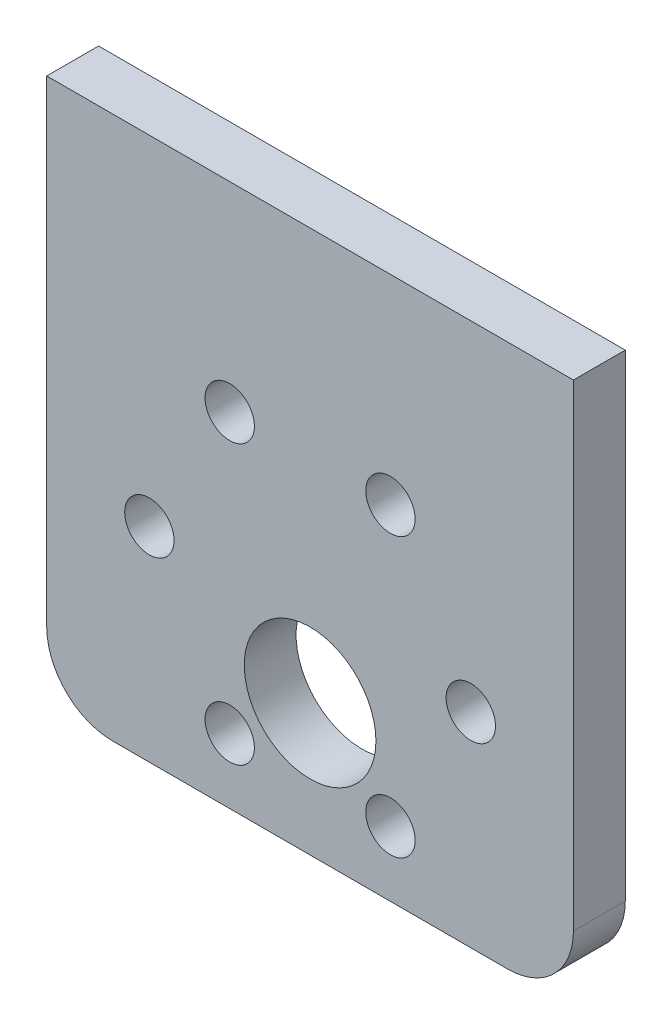
ISO-10303-21;
HEADER;
FILE_DESCRIPTION(('STEP AP214'),'2;1');
FILE_NAME('part.step','',(''),(''),'','','');
FILE_SCHEMA(('AUTOMOTIVE_DESIGN { 1 0 10303 214 1 1 1 1 }'));
ENDSEC;
DATA;
#1=APPLICATION_CONTEXT('core data for automotive mechanical design processes');
#2=APPLICATION_PROTOCOL_DEFINITION('international standard','automotive_design',2000,#1);
#3=PRODUCT_CONTEXT('',#1,'mechanical');
#4=PRODUCT('Part','Part','',(#3));
#5=PRODUCT_RELATED_PRODUCT_CATEGORY('part','',(#4));
#6=PRODUCT_DEFINITION_FORMATION('','',#4);
#7=PRODUCT_DEFINITION_CONTEXT('part definition',#1,'design');
#8=PRODUCT_DEFINITION('design','',#6,#7);
#9=PRODUCT_DEFINITION_SHAPE('','',#8);
#10=(LENGTH_UNIT() NAMED_UNIT(*) SI_UNIT(.MILLI.,.METRE.));
#11=(NAMED_UNIT(*) PLANE_ANGLE_UNIT() SI_UNIT($,.RADIAN.));
#12=(NAMED_UNIT(*) SI_UNIT($,.STERADIAN.) SOLID_ANGLE_UNIT());
#13=UNCERTAINTY_MEASURE_WITH_UNIT(LENGTH_MEASURE(1.E-05),#10,'distance_accuracy_value','');
#14=(GEOMETRIC_REPRESENTATION_CONTEXT(3) GLOBAL_UNCERTAINTY_ASSIGNED_CONTEXT((#13)) GLOBAL_UNIT_ASSIGNED_CONTEXT((#10,
#11,#12)) REPRESENTATION_CONTEXT('',''));
#15=CARTESIAN_POINT('',(0.,0.,0.));
#16=DIRECTION('',(0.,0.,1.));
#17=DIRECTION('',(1.,0.,0.));
#18=AXIS2_PLACEMENT_3D('',#15,#16,#17);
#19=CARTESIAN_POINT('',(25.4,-26.1874,2.5));
#20=DIRECTION('',(-1.,0.,0.));
#21=DIRECTION('',(0.,0.,1.));
#22=AXIS2_PLACEMENT_3D('',#19,#20,#21);
#23=PLANE('',#22);
#24=DIRECTION('',(0.,1.,0.));
#25=VECTOR('',#24,1.);
#26=CARTESIAN_POINT('',(25.4,-26.1874,2.5));
#27=LINE('',#26,#25);
#28=CARTESIAN_POINT('',(25.4,-19.8374,2.5));
#29=VERTEX_POINT('',#28);
#30=CARTESIAN_POINT('',(25.4,26.1874,2.5));
#31=VERTEX_POINT('',#30);
#32=EDGE_CURVE('E88',#29,#31,#27,.T.);
#33=ORIENTED_EDGE('',*,*,#32,.F.);
#34=DIRECTION('',(0.,0.,-1.));
#35=VECTOR('',#34,1.);
#36=CARTESIAN_POINT('',(25.4,-19.8374,2.5));
#37=LINE('',#36,#35);
#38=CARTESIAN_POINT('',(25.4,-19.8374,-2.5));
#39=VERTEX_POINT('',#38);
#40=EDGE_CURVE('E111',#29,#39,#37,.T.);
#41=ORIENTED_EDGE('',*,*,#40,.T.);
#42=DIRECTION('',(0.,1.,0.));
#43=VECTOR('',#42,1.);
#44=CARTESIAN_POINT('',(25.4,-26.1874,-2.5));
#45=LINE('',#44,#43);
#46=CARTESIAN_POINT('',(25.4,26.1874,-2.5));
#47=VERTEX_POINT('',#46);
#48=EDGE_CURVE('E109',#39,#47,#45,.T.);
#49=ORIENTED_EDGE('',*,*,#48,.T.);
#50=DIRECTION('',(0.,0.,-1.));
#51=VECTOR('',#50,1.);
#52=CARTESIAN_POINT('',(25.4,26.1874,2.5));
#53=LINE('',#52,#51);
#54=EDGE_CURVE('E103',#31,#47,#53,.T.);
#55=ORIENTED_EDGE('',*,*,#54,.F.);
#56=EDGE_LOOP('',(#33,#41,#49,#55));
#57=FACE_BOUND('',#56,.T.);
#58=ADVANCED_FACE('F34',(#57),#23,.F.);
#59=CARTESIAN_POINT('',(-25.4,26.1874,2.5));
#60=DIRECTION('',(0.,-1.,0.));
#61=DIRECTION('',(0.,0.,-1.));
#62=AXIS2_PLACEMENT_3D('',#59,#60,#61);
#63=PLANE('',#62);
#64=DIRECTION('',(-1.,0.,0.));
#65=VECTOR('',#64,1.);
#66=CARTESIAN_POINT('',(-25.4,26.1874,-2.5));
#67=LINE('',#66,#65);
#68=CARTESIAN_POINT('',(-25.4,26.1874,-2.5));
#69=VERTEX_POINT('',#68);
#70=EDGE_CURVE('E138',#47,#69,#67,.T.);
#71=ORIENTED_EDGE('',*,*,#70,.T.);
#72=DIRECTION('',(0.,0.,-1.));
#73=VECTOR('',#72,1.);
#74=CARTESIAN_POINT('',(-25.4,26.1874,2.5));
#75=LINE('',#74,#73);
#76=CARTESIAN_POINT('',(-25.4,26.1874,2.5));
#77=VERTEX_POINT('',#76);
#78=EDGE_CURVE('E105',#77,#69,#75,.T.);
#79=ORIENTED_EDGE('',*,*,#78,.F.);
#80=DIRECTION('',(-1.,0.,0.));
#81=VECTOR('',#80,1.);
#82=CARTESIAN_POINT('',(-25.4,26.1874,2.5));
#83=LINE('',#82,#81);
#84=EDGE_CURVE('E91',#31,#77,#83,.T.);
#85=ORIENTED_EDGE('',*,*,#84,.F.);
#86=ORIENTED_EDGE('',*,*,#54,.T.);
#87=EDGE_LOOP('',(#71,#79,#85,#86));
#88=FACE_BOUND('',#87,.T.);
#89=ADVANCED_FACE('F102',(#88),#63,.F.);
#90=CARTESIAN_POINT('',(-25.4,-26.1874,2.5));
#91=DIRECTION('',(1.,0.,0.));
#92=DIRECTION('',(0.,0.,-1.));
#93=AXIS2_PLACEMENT_3D('',#90,#91,#92);
#94=PLANE('',#93);
#95=DIRECTION('',(0.,-1.,0.));
#96=VECTOR('',#95,1.);
#97=CARTESIAN_POINT('',(-25.4,-26.1874,-2.5));
#98=LINE('',#97,#96);
#99=CARTESIAN_POINT('',(-25.4,-19.8374,-2.5));
#100=VERTEX_POINT('',#99);
#101=EDGE_CURVE('E136',#69,#100,#98,.T.);
#102=ORIENTED_EDGE('',*,*,#101,.T.);
#103=DIRECTION('',(0.,0.,-1.));
#104=VECTOR('',#103,1.);
#105=CARTESIAN_POINT('',(-25.4,-19.8374,2.5));
#106=LINE('',#105,#104);
#107=CARTESIAN_POINT('',(-25.4,-19.8374,2.5));
#108=VERTEX_POINT('',#107);
#109=EDGE_CURVE('E11',#100,#108,#106,.F.);
#110=ORIENTED_EDGE('',*,*,#109,.T.);
#111=DIRECTION('',(0.,-1.,0.));
#112=VECTOR('',#111,1.);
#113=CARTESIAN_POINT('',(-25.4,-26.1874,2.5));
#114=LINE('',#113,#112);
#115=EDGE_CURVE('E106',#77,#108,#114,.T.);
#116=ORIENTED_EDGE('',*,*,#115,.F.);
#117=ORIENTED_EDGE('',*,*,#78,.T.);
#118=EDGE_LOOP('',(#102,#110,#116,#117));
#119=FACE_BOUND('',#118,.T.);
#120=ADVANCED_FACE('F137',(#119),#94,.F.);
#121=CARTESIAN_POINT('',(-25.4,-26.1874,2.5));
#122=DIRECTION('',(0.,1.,0.));
#123=DIRECTION('',(0.,0.,1.));
#124=AXIS2_PLACEMENT_3D('',#121,#122,#123);
#125=PLANE('',#124);
#126=DIRECTION('',(1.,0.,0.));
#127=VECTOR('',#126,1.);
#128=CARTESIAN_POINT('',(-25.4,-26.1874,-2.5));
#129=LINE('',#128,#127);
#130=CARTESIAN_POINT('',(-19.05,-26.1874,-2.5));
#131=VERTEX_POINT('',#130);
#132=CARTESIAN_POINT('',(19.05,-26.1874,-2.5));
#133=VERTEX_POINT('',#132);
#134=EDGE_CURVE('E98',#131,#133,#129,.T.);
#135=ORIENTED_EDGE('',*,*,#134,.T.);
#136=DIRECTION('',(0.,0.,-1.));
#137=VECTOR('',#136,1.);
#138=CARTESIAN_POINT('',(19.05,-26.1874,2.5));
#139=LINE('',#138,#137);
#140=CARTESIAN_POINT('',(19.05,-26.1874,2.5));
#141=VERTEX_POINT('',#140);
#142=EDGE_CURVE('E55',#133,#141,#139,.F.);
#143=ORIENTED_EDGE('',*,*,#142,.T.);
#144=DIRECTION('',(1.,0.,0.));
#145=VECTOR('',#144,1.);
#146=CARTESIAN_POINT('',(-25.4,-26.1874,2.5));
#147=LINE('',#146,#145);
#148=CARTESIAN_POINT('',(-19.05,-26.1874,2.5));
#149=VERTEX_POINT('',#148);
#150=EDGE_CURVE('E115',#149,#141,#147,.T.);
#151=ORIENTED_EDGE('',*,*,#150,.F.);
#152=DIRECTION('',(0.,0.,-1.));
#153=VECTOR('',#152,1.);
#154=CARTESIAN_POINT('',(-19.05,-26.1874,2.5));
#155=LINE('',#154,#153);
#156=EDGE_CURVE('E122',#149,#131,#155,.T.);
#157=ORIENTED_EDGE('',*,*,#156,.T.);
#158=EDGE_LOOP('',(#135,#143,#151,#157));
#159=FACE_BOUND('',#158,.T.);
#160=ADVANCED_FACE('F130',(#159),#125,.F.);
#161=CARTESIAN_POINT('',(0.,0.,2.5));
#162=DIRECTION('',(0.,0.,-1.));
#163=DIRECTION('',(-1.,0.,0.));
#164=AXIS2_PLACEMENT_3D('',#161,#162,#163);
#165=PLANE('',#164);
#166=CARTESIAN_POINT('',(-15.5,-6.48740000000015,2.5));
#167=DIRECTION('',(0.,0.,-1.));
#168=DIRECTION('',(-1.,0.,0.));
#169=AXIS2_PLACEMENT_3D('',#166,#167,#168);
#170=CIRCLE('',#169,2.38125);
#171=CARTESIAN_POINT('',(-17.88125,-6.48740000000015,2.5));
#172=VERTEX_POINT('',#171);
#173=EDGE_CURVE('E180',#172,#172,#170,.T.);
#174=ORIENTED_EDGE('',*,*,#173,.T.);
#175=EDGE_LOOP('',(#174));
#176=FACE_BOUND('',#175,.T.);
#177=CARTESIAN_POINT('',(-7.75000000000013,6.93599375865875,2.5));
#178=DIRECTION('',(0.,0.,-1.));
#179=DIRECTION('',(-1.,0.,0.));
#180=AXIS2_PLACEMENT_3D('',#177,#178,#179);
#181=CIRCLE('',#180,2.38125);
#182=CARTESIAN_POINT('',(-10.1312500000001,6.93599375865875,2.5));
#183=VERTEX_POINT('',#182);
#184=EDGE_CURVE('E174',#183,#183,#181,.T.);
#185=ORIENTED_EDGE('',*,*,#184,.T.);
#186=EDGE_LOOP('',(#185));
#187=FACE_BOUND('',#186,.T.);
#188=CARTESIAN_POINT('',(7.75,6.93599375865881,2.5));
#189=DIRECTION('',(0.,0.,-1.));
#190=DIRECTION('',(-1.,0.,0.));
#191=AXIS2_PLACEMENT_3D('',#188,#189,#190);
#192=CIRCLE('',#191,2.38125);
#193=CARTESIAN_POINT('',(5.36875,6.93599375865881,2.5));
#194=VERTEX_POINT('',#193);
#195=EDGE_CURVE('E168',#194,#194,#192,.T.);
#196=ORIENTED_EDGE('',*,*,#195,.T.);
#197=EDGE_LOOP('',(#196));
#198=FACE_BOUND('',#197,.T.);
#199=CARTESIAN_POINT('',(15.5,-6.48739999999993,2.5));
#200=DIRECTION('',(0.,0.,-1.));
#201=DIRECTION('',(-1.,0.,0.));
#202=AXIS2_PLACEMENT_3D('',#199,#200,#201);
#203=CIRCLE('',#202,2.38125);
#204=CARTESIAN_POINT('',(13.11875,-6.48739999999993,2.5));
#205=VERTEX_POINT('',#204);
#206=EDGE_CURVE('E162',#205,#205,#203,.T.);
#207=ORIENTED_EDGE('',*,*,#206,.T.);
#208=EDGE_LOOP('',(#207));
#209=FACE_BOUND('',#208,.T.);
#210=CARTESIAN_POINT('',(-7.75000000000003,-19.9107937586588,2.5));
#211=DIRECTION('',(0.,0.,-1.));
#212=DIRECTION('',(-1.,0.,0.));
#213=AXIS2_PLACEMENT_3D('',#210,#211,#212);
#214=CIRCLE('',#213,2.38125);
#215=CARTESIAN_POINT('',(-10.13125,-19.9107937586588,2.5));
#216=VERTEX_POINT('',#215);
#217=EDGE_CURVE('E156',#216,#216,#214,.T.);
#218=ORIENTED_EDGE('',*,*,#217,.T.);
#219=EDGE_LOOP('',(#218));
#220=FACE_BOUND('',#219,.T.);
#221=CARTESIAN_POINT('',(7.75,-19.9107937586588,2.5));
#222=DIRECTION('',(0.,0.,-1.));
#223=DIRECTION('',(-1.,0.,0.));
#224=AXIS2_PLACEMENT_3D('',#221,#222,#223);
#225=CIRCLE('',#224,2.38125);
#226=CARTESIAN_POINT('',(5.36875,-19.9107937586588,2.5));
#227=VERTEX_POINT('',#226);
#228=EDGE_CURVE('E150',#227,#227,#225,.T.);
#229=ORIENTED_EDGE('',*,*,#228,.T.);
#230=EDGE_LOOP('',(#229));
#231=FACE_BOUND('',#230,.T.);
#232=CARTESIAN_POINT('',(0.,-13.4874,2.5));
#233=DIRECTION('',(0.,0.,1.));
#234=DIRECTION('',(1.,0.,0.));
#235=AXIS2_PLACEMENT_3D('',#232,#233,#234);
#236=CIRCLE('',#235,6.34999999999999);
#237=CARTESIAN_POINT('',(6.34999999999999,-13.4874,2.5));
#238=VERTEX_POINT('',#237);
#239=EDGE_CURVE('E147',#238,#238,#236,.T.);
#240=ORIENTED_EDGE('',*,*,#239,.F.);
#241=EDGE_LOOP('',(#240));
#242=FACE_BOUND('',#241,.T.);
#243=ORIENTED_EDGE('',*,*,#150,.T.);
#244=CARTESIAN_POINT('',(19.05,-19.8374,2.5));
#245=DIRECTION('',(0.,0.,-1.));
#246=DIRECTION('',(-1.,0.,0.));
#247=AXIS2_PLACEMENT_3D('',#244,#245,#246);
#248=CIRCLE('',#247,6.35);
#249=EDGE_CURVE('E42',#141,#29,#248,.F.);
#250=ORIENTED_EDGE('',*,*,#249,.T.);
#251=ORIENTED_EDGE('',*,*,#32,.T.);
#252=ORIENTED_EDGE('',*,*,#84,.T.);
#253=ORIENTED_EDGE('',*,*,#115,.T.);
#254=CARTESIAN_POINT('',(-19.05,-19.8374,2.5));
#255=DIRECTION('',(0.,0.,-1.));
#256=DIRECTION('',(-1.,0.,0.));
#257=AXIS2_PLACEMENT_3D('',#254,#255,#256);
#258=CIRCLE('',#257,6.35);
#259=EDGE_CURVE('E126',#108,#149,#258,.F.);
#260=ORIENTED_EDGE('',*,*,#259,.T.);
#261=EDGE_LOOP('',(#243,#250,#251,#252,#253,#260));
#262=FACE_BOUND('',#261,.T.);
#263=ADVANCED_FACE('F90',(#176,#187,#198,#209,#220,#231,#242,#262),#165,.F.);
#264=CARTESIAN_POINT('',(0.,0.,-2.5));
#265=DIRECTION('',(0.,0.,-1.));
#266=DIRECTION('',(-1.,0.,0.));
#267=AXIS2_PLACEMENT_3D('',#264,#265,#266);
#268=PLANE('',#267);
#269=CARTESIAN_POINT('',(-15.5,-6.48740000000015,-2.5));
#270=DIRECTION('',(0.,0.,-1.));
#271=DIRECTION('',(-1.,0.,0.));
#272=AXIS2_PLACEMENT_3D('',#269,#270,#271);
#273=CIRCLE('',#272,2.38125);
#274=CARTESIAN_POINT('',(-17.88125,-6.48740000000015,-2.5));
#275=VERTEX_POINT('',#274);
#276=EDGE_CURVE('E183',#275,#275,#273,.T.);
#277=ORIENTED_EDGE('',*,*,#276,.F.);
#278=EDGE_LOOP('',(#277));
#279=FACE_BOUND('',#278,.T.);
#280=CARTESIAN_POINT('',(-7.75000000000013,6.93599375865875,-2.5));
#281=DIRECTION('',(0.,0.,-1.));
#282=DIRECTION('',(-1.,0.,0.));
#283=AXIS2_PLACEMENT_3D('',#280,#281,#282);
#284=CIRCLE('',#283,2.38125);
#285=CARTESIAN_POINT('',(-10.1312500000001,6.93599375865875,-2.5));
#286=VERTEX_POINT('',#285);
#287=EDGE_CURVE('E177',#286,#286,#284,.T.);
#288=ORIENTED_EDGE('',*,*,#287,.F.);
#289=EDGE_LOOP('',(#288));
#290=FACE_BOUND('',#289,.T.);
#291=CARTESIAN_POINT('',(7.75,6.93599375865881,-2.5));
#292=DIRECTION('',(0.,0.,-1.));
#293=DIRECTION('',(-1.,0.,0.));
#294=AXIS2_PLACEMENT_3D('',#291,#292,#293);
#295=CIRCLE('',#294,2.38125);
#296=CARTESIAN_POINT('',(5.36875,6.93599375865881,-2.5));
#297=VERTEX_POINT('',#296);
#298=EDGE_CURVE('E171',#297,#297,#295,.T.);
#299=ORIENTED_EDGE('',*,*,#298,.F.);
#300=EDGE_LOOP('',(#299));
#301=FACE_BOUND('',#300,.T.);
#302=CARTESIAN_POINT('',(15.5,-6.48739999999993,-2.5));
#303=DIRECTION('',(0.,0.,-1.));
#304=DIRECTION('',(-1.,0.,0.));
#305=AXIS2_PLACEMENT_3D('',#302,#303,#304);
#306=CIRCLE('',#305,2.38125);
#307=CARTESIAN_POINT('',(13.11875,-6.48739999999993,-2.5));
#308=VERTEX_POINT('',#307);
#309=EDGE_CURVE('E165',#308,#308,#306,.T.);
#310=ORIENTED_EDGE('',*,*,#309,.F.);
#311=EDGE_LOOP('',(#310));
#312=FACE_BOUND('',#311,.T.);
#313=CARTESIAN_POINT('',(-7.75000000000003,-19.9107937586588,-2.5));
#314=DIRECTION('',(0.,0.,-1.));
#315=DIRECTION('',(-1.,0.,0.));
#316=AXIS2_PLACEMENT_3D('',#313,#314,#315);
#317=CIRCLE('',#316,2.38125);
#318=CARTESIAN_POINT('',(-10.13125,-19.9107937586588,-2.5));
#319=VERTEX_POINT('',#318);
#320=EDGE_CURVE('E159',#319,#319,#317,.T.);
#321=ORIENTED_EDGE('',*,*,#320,.F.);
#322=EDGE_LOOP('',(#321));
#323=FACE_BOUND('',#322,.T.);
#324=CARTESIAN_POINT('',(7.75,-19.9107937586588,-2.5));
#325=DIRECTION('',(0.,0.,-1.));
#326=DIRECTION('',(-1.,0.,0.));
#327=AXIS2_PLACEMENT_3D('',#324,#325,#326);
#328=CIRCLE('',#327,2.38125);
#329=CARTESIAN_POINT('',(5.36875,-19.9107937586588,-2.5));
#330=VERTEX_POINT('',#329);
#331=EDGE_CURVE('E153',#330,#330,#328,.T.);
#332=ORIENTED_EDGE('',*,*,#331,.F.);
#333=EDGE_LOOP('',(#332));
#334=FACE_BOUND('',#333,.T.);
#335=CARTESIAN_POINT('',(0.,-13.4874,-2.5));
#336=DIRECTION('',(0.,0.,1.));
#337=DIRECTION('',(1.,0.,0.));
#338=AXIS2_PLACEMENT_3D('',#335,#336,#337);
#339=CIRCLE('',#338,6.35);
#340=CARTESIAN_POINT('',(6.35,-13.4874,-2.5));
#341=VERTEX_POINT('',#340);
#342=EDGE_CURVE('E142',#341,#341,#339,.T.);
#343=ORIENTED_EDGE('',*,*,#342,.T.);
#344=EDGE_LOOP('',(#343));
#345=FACE_BOUND('',#344,.T.);
#346=ORIENTED_EDGE('',*,*,#48,.F.);
#347=CARTESIAN_POINT('',(19.05,-19.8374,-2.5));
#348=DIRECTION('',(0.,0.,-1.));
#349=DIRECTION('',(-1.,0.,0.));
#350=AXIS2_PLACEMENT_3D('',#347,#348,#349);
#351=CIRCLE('',#350,6.35);
#352=EDGE_CURVE('E120',#39,#133,#351,.T.);
#353=ORIENTED_EDGE('',*,*,#352,.T.);
#354=ORIENTED_EDGE('',*,*,#134,.F.);
#355=CARTESIAN_POINT('',(-19.05,-19.8374,-2.5));
#356=DIRECTION('',(0.,0.,-1.));
#357=DIRECTION('',(-1.,0.,0.));
#358=AXIS2_PLACEMENT_3D('',#355,#356,#357);
#359=CIRCLE('',#358,6.35);
#360=EDGE_CURVE('E113',#131,#100,#359,.T.);
#361=ORIENTED_EDGE('',*,*,#360,.T.);
#362=ORIENTED_EDGE('',*,*,#101,.F.);
#363=ORIENTED_EDGE('',*,*,#70,.F.);
#364=EDGE_LOOP('',(#346,#353,#354,#361,#362,#363));
#365=FACE_BOUND('',#364,.T.);
#366=ADVANCED_FACE('F135',(#279,#290,#301,#312,#323,#334,#345,#365),#268,.T.);
#367=CARTESIAN_POINT('',(0.,-13.4874,2.5));
#368=DIRECTION('',(0.,0.,1.));
#369=DIRECTION('',(1.,0.,0.));
#370=AXIS2_PLACEMENT_3D('',#367,#368,#369);
#371=CYLINDRICAL_SURFACE('',#370,6.34999999999999);
#372=ORIENTED_EDGE('',*,*,#342,.F.);
#373=EDGE_LOOP('',(#372));
#374=FACE_BOUND('',#373,.T.);
#375=ORIENTED_EDGE('',*,*,#239,.T.);
#376=EDGE_LOOP('',(#375));
#377=FACE_BOUND('',#376,.T.);
#378=ADVANCED_FACE('F191',(#374,#377),#371,.F.);
#379=CARTESIAN_POINT('',(7.75,-19.9107937586588,-2.5));
#380=DIRECTION('',(0.,0.,-1.));
#381=DIRECTION('',(-1.,0.,0.));
#382=AXIS2_PLACEMENT_3D('',#379,#380,#381);
#383=CYLINDRICAL_SURFACE('',#382,2.38125);
#384=ORIENTED_EDGE('',*,*,#228,.F.);
#385=EDGE_LOOP('',(#384));
#386=FACE_BOUND('',#385,.T.);
#387=ORIENTED_EDGE('',*,*,#331,.T.);
#388=EDGE_LOOP('',(#387));
#389=FACE_BOUND('',#388,.T.);
#390=ADVANCED_FACE('F207',(#386,#389),#383,.F.);
#391=CARTESIAN_POINT('',(-7.75000000000003,-19.9107937586588,-2.5));
#392=DIRECTION('',(0.,0.,-1.));
#393=DIRECTION('',(-1.,0.,0.));
#394=AXIS2_PLACEMENT_3D('',#391,#392,#393);
#395=CYLINDRICAL_SURFACE('',#394,2.38125);
#396=ORIENTED_EDGE('',*,*,#217,.F.);
#397=EDGE_LOOP('',(#396));
#398=FACE_BOUND('',#397,.T.);
#399=ORIENTED_EDGE('',*,*,#320,.T.);
#400=EDGE_LOOP('',(#399));
#401=FACE_BOUND('',#400,.T.);
#402=ADVANCED_FACE('F250',(#398,#401),#395,.F.);
#403=CARTESIAN_POINT('',(15.5,-6.48739999999993,-2.5));
#404=DIRECTION('',(0.,0.,-1.));
#405=DIRECTION('',(-1.,0.,0.));
#406=AXIS2_PLACEMENT_3D('',#403,#404,#405);
#407=CYLINDRICAL_SURFACE('',#406,2.38125);
#408=ORIENTED_EDGE('',*,*,#206,.F.);
#409=EDGE_LOOP('',(#408));
#410=FACE_BOUND('',#409,.T.);
#411=ORIENTED_EDGE('',*,*,#309,.T.);
#412=EDGE_LOOP('',(#411));
#413=FACE_BOUND('',#412,.T.);
#414=ADVANCED_FACE('F246',(#410,#413),#407,.F.);
#415=CARTESIAN_POINT('',(7.75,6.93599375865881,-2.5));
#416=DIRECTION('',(0.,0.,-1.));
#417=DIRECTION('',(-1.,0.,0.));
#418=AXIS2_PLACEMENT_3D('',#415,#416,#417);
#419=CYLINDRICAL_SURFACE('',#418,2.38125);
#420=ORIENTED_EDGE('',*,*,#195,.F.);
#421=EDGE_LOOP('',(#420));
#422=FACE_BOUND('',#421,.T.);
#423=ORIENTED_EDGE('',*,*,#298,.T.);
#424=EDGE_LOOP('',(#423));
#425=FACE_BOUND('',#424,.T.);
#426=ADVANCED_FACE('F239',(#422,#425),#419,.F.);
#427=CARTESIAN_POINT('',(-7.75000000000013,6.93599375865875,-2.5));
#428=DIRECTION('',(0.,0.,-1.));
#429=DIRECTION('',(-1.,0.,0.));
#430=AXIS2_PLACEMENT_3D('',#427,#428,#429);
#431=CYLINDRICAL_SURFACE('',#430,2.38125);
#432=ORIENTED_EDGE('',*,*,#184,.F.);
#433=EDGE_LOOP('',(#432));
#434=FACE_BOUND('',#433,.T.);
#435=ORIENTED_EDGE('',*,*,#287,.T.);
#436=EDGE_LOOP('',(#435));
#437=FACE_BOUND('',#436,.T.);
#438=ADVANCED_FACE('F233',(#434,#437),#431,.F.);
#439=CARTESIAN_POINT('',(-15.5,-6.48740000000015,-2.5));
#440=DIRECTION('',(0.,0.,-1.));
#441=DIRECTION('',(-1.,0.,0.));
#442=AXIS2_PLACEMENT_3D('',#439,#440,#441);
#443=CYLINDRICAL_SURFACE('',#442,2.38125);
#444=ORIENTED_EDGE('',*,*,#173,.F.);
#445=EDGE_LOOP('',(#444));
#446=FACE_BOUND('',#445,.T.);
#447=ORIENTED_EDGE('',*,*,#276,.T.);
#448=EDGE_LOOP('',(#447));
#449=FACE_BOUND('',#448,.T.);
#450=ADVANCED_FACE('F187',(#446,#449),#443,.F.);
#451=CARTESIAN_POINT('',(19.05,-19.8374,2.5));
#452=DIRECTION('',(0.,0.,-1.));
#453=DIRECTION('',(-1.,0.,0.));
#454=AXIS2_PLACEMENT_3D('',#451,#452,#453);
#455=CYLINDRICAL_SURFACE('',#454,6.35);
#456=ORIENTED_EDGE('',*,*,#249,.F.);
#457=ORIENTED_EDGE('',*,*,#142,.F.);
#458=ORIENTED_EDGE('',*,*,#352,.F.);
#459=ORIENTED_EDGE('',*,*,#40,.F.);
#460=EDGE_LOOP('',(#456,#457,#458,#459));
#461=FACE_BOUND('',#460,.T.);
#462=ADVANCED_FACE('F226',(#461),#455,.T.);
#463=CARTESIAN_POINT('',(-19.05,-19.8374,2.5));
#464=DIRECTION('',(0.,0.,-1.));
#465=DIRECTION('',(-1.,0.,0.));
#466=AXIS2_PLACEMENT_3D('',#463,#464,#465);
#467=CYLINDRICAL_SURFACE('',#466,6.35);
#468=ORIENTED_EDGE('',*,*,#259,.F.);
#469=ORIENTED_EDGE('',*,*,#109,.F.);
#470=ORIENTED_EDGE('',*,*,#360,.F.);
#471=ORIENTED_EDGE('',*,*,#156,.F.);
#472=EDGE_LOOP('',(#468,#469,#470,#471));
#473=FACE_BOUND('',#472,.T.);
#474=ADVANCED_FACE('F36',(#473),#467,.T.);
#475=CLOSED_SHELL('',(#58,#89,#120,#160,#263,#366,#378,#390,#402,#414,#426,#438,#450,#462,#474));
#476=MANIFOLD_SOLID_BREP('B2',#475);
#477=ADVANCED_BREP_SHAPE_REPRESENTATION('',(#18,#476),#14);
#478=SHAPE_DEFINITION_REPRESENTATION(#9,#477);
ENDSEC;
END-ISO-10303-21;
